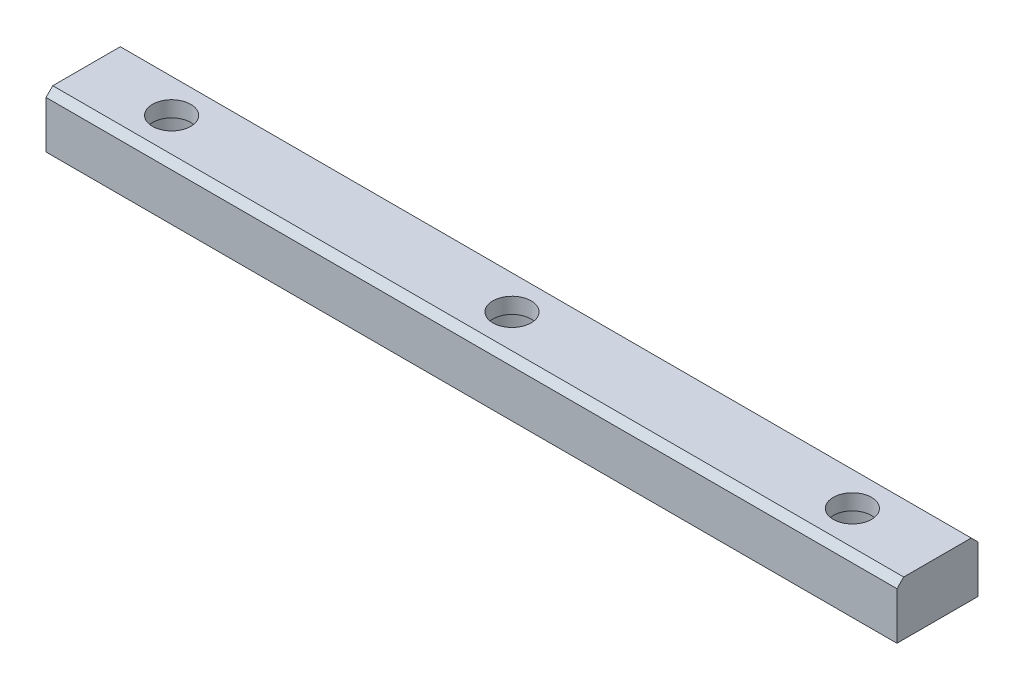
ISO-10303-21;
HEADER;
FILE_DESCRIPTION(('STEP AP214'),'2;1');
FILE_NAME('part.step','',(''),(''),'','','');
FILE_SCHEMA(('AUTOMOTIVE_DESIGN { 1 0 10303 214 1 1 1 1 }'));
ENDSEC;
DATA;
#1=APPLICATION_CONTEXT('core data for automotive mechanical design processes');
#2=APPLICATION_PROTOCOL_DEFINITION('international standard','automotive_design',2000,#1);
#3=PRODUCT_CONTEXT('',#1,'mechanical');
#4=PRODUCT('Part','Part','',(#3));
#5=PRODUCT_RELATED_PRODUCT_CATEGORY('part','',(#4));
#6=PRODUCT_DEFINITION_FORMATION('','',#4);
#7=PRODUCT_DEFINITION_CONTEXT('part definition',#1,'design');
#8=PRODUCT_DEFINITION('design','',#6,#7);
#9=PRODUCT_DEFINITION_SHAPE('','',#8);
#10=(LENGTH_UNIT() NAMED_UNIT(*) SI_UNIT(.MILLI.,.METRE.));
#11=(NAMED_UNIT(*) PLANE_ANGLE_UNIT() SI_UNIT($,.RADIAN.));
#12=(NAMED_UNIT(*) SI_UNIT($,.STERADIAN.) SOLID_ANGLE_UNIT());
#13=UNCERTAINTY_MEASURE_WITH_UNIT(LENGTH_MEASURE(1.E-05),#10,'distance_accuracy_value','');
#14=(GEOMETRIC_REPRESENTATION_CONTEXT(3) GLOBAL_UNCERTAINTY_ASSIGNED_CONTEXT((#13)) GLOBAL_UNIT_ASSIGNED_CONTEXT((#10,
#11,#12)) REPRESENTATION_CONTEXT('',''));
#15=CARTESIAN_POINT('',(0.,0.,0.));
#16=DIRECTION('',(0.,0.,1.));
#17=DIRECTION('',(1.,0.,0.));
#18=AXIS2_PLACEMENT_3D('',#15,#16,#17);
#19=CARTESIAN_POINT('',(100.,6.35,9.525));
#20=DIRECTION('',(0.,0.,-1.));
#21=DIRECTION('',(0.,1.,0.));
#22=AXIS2_PLACEMENT_3D('',#19,#20,#21);
#23=PLANE('',#22);
#24=DIRECTION('',(0.,-1.,0.));
#25=VECTOR('',#24,1.);
#26=CARTESIAN_POINT('',(100.,6.35,9.525));
#27=LINE('',#26,#25);
#28=CARTESIAN_POINT('',(100.,4.76250000000004,9.525));
#29=VERTEX_POINT('',#28);
#30=CARTESIAN_POINT('',(100.,-6.35,9.525));
#31=VERTEX_POINT('',#30);
#32=EDGE_CURVE('E87',#29,#31,#27,.T.);
#33=ORIENTED_EDGE('',*,*,#32,.F.);
#34=DIRECTION('',(-1.,0.,0.));
#35=VECTOR('',#34,1.);
#36=CARTESIAN_POINT('',(100.,4.76250000000003,9.525));
#37=LINE('',#36,#35);
#38=CARTESIAN_POINT('',(-100.,4.76250000000004,9.525));
#39=VERTEX_POINT('',#38);
#40=EDGE_CURVE('E11',#29,#39,#37,.T.);
#41=ORIENTED_EDGE('',*,*,#40,.T.);
#42=DIRECTION('',(0.,-1.,0.));
#43=VECTOR('',#42,1.);
#44=CARTESIAN_POINT('',(-100.,6.35,9.525));
#45=LINE('',#44,#43);
#46=CARTESIAN_POINT('',(-100.,-6.35,9.525));
#47=VERTEX_POINT('',#46);
#48=EDGE_CURVE('E106',#39,#47,#45,.T.);
#49=ORIENTED_EDGE('',*,*,#48,.T.);
#50=DIRECTION('',(-1.,0.,0.));
#51=VECTOR('',#50,1.);
#52=CARTESIAN_POINT('',(100.,-6.35,9.525));
#53=LINE('',#52,#51);
#54=EDGE_CURVE('E100',#31,#47,#53,.T.);
#55=ORIENTED_EDGE('',*,*,#54,.F.);
#56=EDGE_LOOP('',(#33,#41,#49,#55));
#57=FACE_BOUND('',#56,.T.);
#58=ADVANCED_FACE('F34',(#57),#23,.F.);
#59=CARTESIAN_POINT('',(100.,-6.35,9.525));
#60=DIRECTION('',(0.,1.,0.));
#61=DIRECTION('',(0.,0.,1.));
#62=AXIS2_PLACEMENT_3D('',#59,#60,#61);
#63=PLANE('',#62);
#64=CARTESIAN_POINT('',(-80.,-6.35,0.));
#65=DIRECTION('',(0.,-1.,0.));
#66=DIRECTION('',(0.,0.,-1.));
#67=AXIS2_PLACEMENT_3D('',#64,#65,#66);
#68=CIRCLE('',#67,7.49999999999999);
#69=CARTESIAN_POINT('',(-80.,-6.35,-7.49999999999999));
#70=VERTEX_POINT('',#69);
#71=EDGE_CURVE('E178',#70,#70,#68,.T.);
#72=ORIENTED_EDGE('',*,*,#71,.F.);
#73=EDGE_LOOP('',(#72));
#74=FACE_BOUND('',#73,.T.);
#75=CARTESIAN_POINT('',(0.,-6.35,0.));
#76=DIRECTION('',(0.,-1.,0.));
#77=DIRECTION('',(0.,0.,-1.));
#78=AXIS2_PLACEMENT_3D('',#75,#76,#77);
#79=CIRCLE('',#78,7.5);
#80=CARTESIAN_POINT('',(0.,-6.35,-7.5));
#81=VERTEX_POINT('',#80);
#82=EDGE_CURVE('E166',#81,#81,#79,.T.);
#83=ORIENTED_EDGE('',*,*,#82,.F.);
#84=EDGE_LOOP('',(#83));
#85=FACE_BOUND('',#84,.T.);
#86=CARTESIAN_POINT('',(80.,-6.35,0.));
#87=DIRECTION('',(0.,-1.,0.));
#88=DIRECTION('',(0.,0.,-1.));
#89=AXIS2_PLACEMENT_3D('',#86,#87,#88);
#90=CIRCLE('',#89,7.49999999999999);
#91=CARTESIAN_POINT('',(80.,-6.35,-7.49999999999999));
#92=VERTEX_POINT('',#91);
#93=EDGE_CURVE('E154',#92,#92,#90,.T.);
#94=ORIENTED_EDGE('',*,*,#93,.F.);
#95=EDGE_LOOP('',(#94));
#96=FACE_BOUND('',#95,.T.);
#97=DIRECTION('',(0.,0.,-1.));
#98=VECTOR('',#97,1.);
#99=CARTESIAN_POINT('',(-100.,-6.35,9.525));
#100=LINE('',#99,#98);
#101=CARTESIAN_POINT('',(-100.,-6.35,-9.525));
#102=VERTEX_POINT('',#101);
#103=EDGE_CURVE('E139',#47,#102,#100,.T.);
#104=ORIENTED_EDGE('',*,*,#103,.T.);
#105=DIRECTION('',(-1.,0.,0.));
#106=VECTOR('',#105,1.);
#107=CARTESIAN_POINT('',(100.,-6.35,-9.525));
#108=LINE('',#107,#106);
#109=CARTESIAN_POINT('',(100.,-6.35,-9.525));
#110=VERTEX_POINT('',#109);
#111=EDGE_CURVE('E102',#110,#102,#108,.T.);
#112=ORIENTED_EDGE('',*,*,#111,.F.);
#113=DIRECTION('',(0.,0.,-1.));
#114=VECTOR('',#113,1.);
#115=CARTESIAN_POINT('',(100.,-6.35,9.525));
#116=LINE('',#115,#114);
#117=EDGE_CURVE('E90',#31,#110,#116,.T.);
#118=ORIENTED_EDGE('',*,*,#117,.F.);
#119=ORIENTED_EDGE('',*,*,#54,.T.);
#120=EDGE_LOOP('',(#104,#112,#118,#119));
#121=FACE_BOUND('',#120,.T.);
#122=ADVANCED_FACE('F99',(#74,#85,#96,#121),#63,.F.);
#123=CARTESIAN_POINT('',(100.,6.35,-9.525));
#124=DIRECTION('',(0.,0.,1.));
#125=DIRECTION('',(0.,-1.,0.));
#126=AXIS2_PLACEMENT_3D('',#123,#124,#125);
#127=PLANE('',#126);
#128=DIRECTION('',(0.,1.,0.));
#129=VECTOR('',#128,1.);
#130=CARTESIAN_POINT('',(-100.,6.35,-9.525));
#131=LINE('',#130,#129);
#132=CARTESIAN_POINT('',(-100.,4.76250000000003,-9.525));
#133=VERTEX_POINT('',#132);
#134=EDGE_CURVE('E137',#102,#133,#131,.T.);
#135=ORIENTED_EDGE('',*,*,#134,.T.);
#136=DIRECTION('',(1.,0.,0.));
#137=VECTOR('',#136,1.);
#138=CARTESIAN_POINT('',(100.,4.76250000000003,-9.525));
#139=LINE('',#138,#137);
#140=CARTESIAN_POINT('',(100.,4.76250000000004,-9.525));
#141=VERTEX_POINT('',#140);
#142=EDGE_CURVE('E57',#133,#141,#139,.T.);
#143=ORIENTED_EDGE('',*,*,#142,.T.);
#144=DIRECTION('',(0.,1.,0.));
#145=VECTOR('',#144,1.);
#146=CARTESIAN_POINT('',(100.,6.35,-9.525));
#147=LINE('',#146,#145);
#148=EDGE_CURVE('E103',#110,#141,#147,.T.);
#149=ORIENTED_EDGE('',*,*,#148,.F.);
#150=ORIENTED_EDGE('',*,*,#111,.T.);
#151=EDGE_LOOP('',(#135,#143,#149,#150));
#152=FACE_BOUND('',#151,.T.);
#153=ADVANCED_FACE('F138',(#152),#127,.F.);
#154=CARTESIAN_POINT('',(100.,6.35,9.525));
#155=DIRECTION('',(0.,-1.,0.));
#156=DIRECTION('',(0.,0.,-1.));
#157=AXIS2_PLACEMENT_3D('',#154,#155,#156);
#158=PLANE('',#157);
#159=CARTESIAN_POINT('',(-80.,6.35,0.));
#160=DIRECTION('',(0.,-1.,0.));
#161=DIRECTION('',(0.,0.,-1.));
#162=AXIS2_PLACEMENT_3D('',#159,#160,#161);
#163=CIRCLE('',#162,4.49999999999999);
#164=CARTESIAN_POINT('',(-80.,6.35,-4.49999999999999));
#165=VERTEX_POINT('',#164);
#166=EDGE_CURVE('E169',#165,#165,#163,.T.);
#167=ORIENTED_EDGE('',*,*,#166,.T.);
#168=EDGE_LOOP('',(#167));
#169=FACE_BOUND('',#168,.T.);
#170=CARTESIAN_POINT('',(0.,6.35,0.));
#171=DIRECTION('',(0.,-1.,0.));
#172=DIRECTION('',(0.,0.,-1.));
#173=AXIS2_PLACEMENT_3D('',#170,#171,#172);
#174=CIRCLE('',#173,4.5);
#175=CARTESIAN_POINT('',(0.,6.35,-4.5));
#176=VERTEX_POINT('',#175);
#177=EDGE_CURVE('E157',#176,#176,#174,.T.);
#178=ORIENTED_EDGE('',*,*,#177,.T.);
#179=EDGE_LOOP('',(#178));
#180=FACE_BOUND('',#179,.T.);
#181=CARTESIAN_POINT('',(80.,6.35,0.));
#182=DIRECTION('',(0.,-1.,0.));
#183=DIRECTION('',(0.,0.,-1.));
#184=AXIS2_PLACEMENT_3D('',#181,#182,#183);
#185=CIRCLE('',#184,4.5);
#186=CARTESIAN_POINT('',(80.,6.35,-4.5));
#187=VERTEX_POINT('',#186);
#188=EDGE_CURVE('E143',#187,#187,#185,.T.);
#189=ORIENTED_EDGE('',*,*,#188,.T.);
#190=EDGE_LOOP('',(#189));
#191=FACE_BOUND('',#190,.T.);
#192=DIRECTION('',(0.,0.,1.));
#193=VECTOR('',#192,1.);
#194=CARTESIAN_POINT('',(100.,6.35,9.525));
#195=LINE('',#194,#193);
#196=CARTESIAN_POINT('',(100.,6.35,-7.93750000000003));
#197=VERTEX_POINT('',#196);
#198=CARTESIAN_POINT('',(100.,6.35,7.93750000000001));
#199=VERTEX_POINT('',#198);
#200=EDGE_CURVE('E112',#197,#199,#195,.T.);
#201=ORIENTED_EDGE('',*,*,#200,.F.);
#202=DIRECTION('',(-1.,0.,0.));
#203=VECTOR('',#202,1.);
#204=CARTESIAN_POINT('',(100.,6.35,-7.93750000000003));
#205=LINE('',#204,#203);
#206=CARTESIAN_POINT('',(-100.,6.35,-7.93750000000003));
#207=VERTEX_POINT('',#206);
#208=EDGE_CURVE('E110',#197,#207,#205,.T.);
#209=ORIENTED_EDGE('',*,*,#208,.T.);
#210=DIRECTION('',(0.,0.,1.));
#211=VECTOR('',#210,1.);
#212=CARTESIAN_POINT('',(-100.,6.35,9.525));
#213=LINE('',#212,#211);
#214=CARTESIAN_POINT('',(-100.,6.35,7.93750000000001));
#215=VERTEX_POINT('',#214);
#216=EDGE_CURVE('E95',#207,#215,#213,.T.);
#217=ORIENTED_EDGE('',*,*,#216,.T.);
#218=DIRECTION('',(1.,0.,0.));
#219=VECTOR('',#218,1.);
#220=CARTESIAN_POINT('',(100.,6.35,7.93750000000001));
#221=LINE('',#220,#219);
#222=EDGE_CURVE('E108',#215,#199,#221,.T.);
#223=ORIENTED_EDGE('',*,*,#222,.T.);
#224=EDGE_LOOP('',(#201,#209,#217,#223));
#225=FACE_BOUND('',#224,.T.);
#226=ADVANCED_FACE('F128',(#169,#180,#191,#225),#158,.F.);
#227=CARTESIAN_POINT('',(100.,0.,0.));
#228=DIRECTION('',(1.,0.,0.));
#229=DIRECTION('',(0.,0.,-1.));
#230=AXIS2_PLACEMENT_3D('',#227,#228,#229);
#231=PLANE('',#230);
#232=ORIENTED_EDGE('',*,*,#148,.T.);
#233=DIRECTION('',(0.,-0.707106781186547,-0.707106781186548));
#234=VECTOR('',#233,1.);
#235=CARTESIAN_POINT('',(100.,7.14375000000002,-7.14375000000001));
#236=LINE('',#235,#234);
#237=EDGE_CURVE('E42',#141,#197,#236,.F.);
#238=ORIENTED_EDGE('',*,*,#237,.T.);
#239=ORIENTED_EDGE('',*,*,#200,.T.);
#240=DIRECTION('',(0.,0.707106781186541,-0.707106781186554));
#241=VECTOR('',#240,1.);
#242=CARTESIAN_POINT('',(100.,7.14375000000006,7.14374999999993));
#243=LINE('',#242,#241);
#244=EDGE_CURVE('E49',#199,#29,#243,.F.);
#245=ORIENTED_EDGE('',*,*,#244,.T.);
#246=ORIENTED_EDGE('',*,*,#32,.T.);
#247=ORIENTED_EDGE('',*,*,#117,.T.);
#248=EDGE_LOOP('',(#232,#238,#239,#245,#246,#247));
#249=FACE_BOUND('',#248,.T.);
#250=ADVANCED_FACE('F89',(#249),#231,.T.);
#251=CARTESIAN_POINT('',(-100.,0.,0.));
#252=DIRECTION('',(1.,0.,0.));
#253=DIRECTION('',(0.,0.,-1.));
#254=AXIS2_PLACEMENT_3D('',#251,#252,#253);
#255=PLANE('',#254);
#256=ORIENTED_EDGE('',*,*,#216,.F.);
#257=DIRECTION('',(0.,0.707106781186547,0.707106781186548));
#258=VECTOR('',#257,1.);
#259=CARTESIAN_POINT('',(-100.,6.35,-7.93750000000003));
#260=LINE('',#259,#258);
#261=EDGE_CURVE('E120',#207,#133,#260,.F.);
#262=ORIENTED_EDGE('',*,*,#261,.T.);
#263=ORIENTED_EDGE('',*,*,#134,.F.);
#264=ORIENTED_EDGE('',*,*,#103,.F.);
#265=ORIENTED_EDGE('',*,*,#48,.F.);
#266=DIRECTION('',(0.,-0.707106781186541,0.707106781186554));
#267=VECTOR('',#266,1.);
#268=CARTESIAN_POINT('',(-100.,4.76250000000003,9.525));
#269=LINE('',#268,#267);
#270=EDGE_CURVE('E118',#39,#215,#269,.F.);
#271=ORIENTED_EDGE('',*,*,#270,.T.);
#272=EDGE_LOOP('',(#256,#262,#263,#264,#265,#271));
#273=FACE_BOUND('',#272,.T.);
#274=ADVANCED_FACE('F136',(#273),#255,.F.);
#275=CARTESIAN_POINT('',(80.,-6.35,0.));
#276=DIRECTION('',(0.,-1.,0.));
#277=DIRECTION('',(0.,0.,-1.));
#278=AXIS2_PLACEMENT_3D('',#275,#276,#277);
#279=CYLINDRICAL_SURFACE('',#278,4.5);
#280=ORIENTED_EDGE('',*,*,#188,.F.);
#281=EDGE_LOOP('',(#280));
#282=FACE_BOUND('',#281,.T.);
#283=CARTESIAN_POINT('',(80.,2.65,0.));
#284=DIRECTION('',(0.,-1.,0.));
#285=DIRECTION('',(0.,0.,-1.));
#286=AXIS2_PLACEMENT_3D('',#283,#284,#285);
#287=CIRCLE('',#286,4.5);
#288=CARTESIAN_POINT('',(80.,2.65,-4.5));
#289=VERTEX_POINT('',#288);
#290=EDGE_CURVE('E148',#289,#289,#287,.T.);
#291=ORIENTED_EDGE('',*,*,#290,.T.);
#292=EDGE_LOOP('',(#291));
#293=FACE_BOUND('',#292,.T.);
#294=ADVANCED_FACE('F204',(#282,#293),#279,.F.);
#295=CARTESIAN_POINT('',(84.5,2.65,0.));
#296=DIRECTION('',(0.,1.,0.));
#297=DIRECTION('',(0.,0.,1.));
#298=AXIS2_PLACEMENT_3D('',#295,#296,#297);
#299=PLANE('',#298);
#300=ORIENTED_EDGE('',*,*,#290,.F.);
#301=EDGE_LOOP('',(#300));
#302=FACE_BOUND('',#301,.T.);
#303=CARTESIAN_POINT('',(80.,2.65,0.));
#304=DIRECTION('',(0.,-1.,0.));
#305=DIRECTION('',(0.,0.,-1.));
#306=AXIS2_PLACEMENT_3D('',#303,#304,#305);
#307=CIRCLE('',#306,7.49999999999999);
#308=CARTESIAN_POINT('',(80.,2.65,-7.49999999999999));
#309=VERTEX_POINT('',#308);
#310=EDGE_CURVE('E151',#309,#309,#307,.T.);
#311=ORIENTED_EDGE('',*,*,#310,.T.);
#312=EDGE_LOOP('',(#311));
#313=FACE_BOUND('',#312,.T.);
#314=ADVANCED_FACE('F194',(#302,#313),#299,.F.);
#315=CARTESIAN_POINT('',(80.,-6.35,0.));
#316=DIRECTION('',(0.,-1.,0.));
#317=DIRECTION('',(0.,0.,-1.));
#318=AXIS2_PLACEMENT_3D('',#315,#316,#317);
#319=CYLINDRICAL_SURFACE('',#318,7.49999999999999);
#320=ORIENTED_EDGE('',*,*,#310,.F.);
#321=EDGE_LOOP('',(#320));
#322=FACE_BOUND('',#321,.T.);
#323=ORIENTED_EDGE('',*,*,#93,.T.);
#324=EDGE_LOOP('',(#323));
#325=FACE_BOUND('',#324,.T.);
#326=ADVANCED_FACE('F191',(#322,#325),#319,.F.);
#327=CARTESIAN_POINT('',(0.,-6.35,0.));
#328=DIRECTION('',(0.,-1.,0.));
#329=DIRECTION('',(0.,0.,-1.));
#330=AXIS2_PLACEMENT_3D('',#327,#328,#329);
#331=CYLINDRICAL_SURFACE('',#330,4.5);
#332=ORIENTED_EDGE('',*,*,#177,.F.);
#333=EDGE_LOOP('',(#332));
#334=FACE_BOUND('',#333,.T.);
#335=CARTESIAN_POINT('',(0.,2.65,0.));
#336=DIRECTION('',(0.,-1.,0.));
#337=DIRECTION('',(0.,0.,-1.));
#338=AXIS2_PLACEMENT_3D('',#335,#336,#337);
#339=CIRCLE('',#338,4.5);
#340=CARTESIAN_POINT('',(0.,2.65,-4.5));
#341=VERTEX_POINT('',#340);
#342=EDGE_CURVE('E160',#341,#341,#339,.T.);
#343=ORIENTED_EDGE('',*,*,#342,.T.);
#344=EDGE_LOOP('',(#343));
#345=FACE_BOUND('',#344,.T.);
#346=ADVANCED_FACE('F193',(#334,#345),#331,.F.);
#347=CARTESIAN_POINT('',(4.5,2.65,0.));
#348=DIRECTION('',(0.,1.,0.));
#349=DIRECTION('',(0.,0.,1.));
#350=AXIS2_PLACEMENT_3D('',#347,#348,#349);
#351=PLANE('',#350);
#352=ORIENTED_EDGE('',*,*,#342,.F.);
#353=EDGE_LOOP('',(#352));
#354=FACE_BOUND('',#353,.T.);
#355=CARTESIAN_POINT('',(0.,2.65,0.));
#356=DIRECTION('',(0.,-1.,0.));
#357=DIRECTION('',(0.,0.,-1.));
#358=AXIS2_PLACEMENT_3D('',#355,#356,#357);
#359=CIRCLE('',#358,7.5);
#360=CARTESIAN_POINT('',(0.,2.65,-7.5));
#361=VERTEX_POINT('',#360);
#362=EDGE_CURVE('E163',#361,#361,#359,.T.);
#363=ORIENTED_EDGE('',*,*,#362,.T.);
#364=EDGE_LOOP('',(#363));
#365=FACE_BOUND('',#364,.T.);
#366=ADVANCED_FACE('F201',(#354,#365),#351,.F.);
#367=CARTESIAN_POINT('',(0.,-6.35,0.));
#368=DIRECTION('',(0.,-1.,0.));
#369=DIRECTION('',(0.,0.,-1.));
#370=AXIS2_PLACEMENT_3D('',#367,#368,#369);
#371=CYLINDRICAL_SURFACE('',#370,7.5);
#372=ORIENTED_EDGE('',*,*,#362,.F.);
#373=EDGE_LOOP('',(#372));
#374=FACE_BOUND('',#373,.T.);
#375=ORIENTED_EDGE('',*,*,#82,.T.);
#376=EDGE_LOOP('',(#375));
#377=FACE_BOUND('',#376,.T.);
#378=ADVANCED_FACE('F232',(#374,#377),#371,.F.);
#379=CARTESIAN_POINT('',(-80.,-6.35,0.));
#380=DIRECTION('',(0.,-1.,0.));
#381=DIRECTION('',(0.,0.,-1.));
#382=AXIS2_PLACEMENT_3D('',#379,#380,#381);
#383=CYLINDRICAL_SURFACE('',#382,4.5);
#384=ORIENTED_EDGE('',*,*,#166,.F.);
#385=EDGE_LOOP('',(#384));
#386=FACE_BOUND('',#385,.T.);
#387=CARTESIAN_POINT('',(-80.,2.65,0.));
#388=DIRECTION('',(0.,-1.,0.));
#389=DIRECTION('',(0.,0.,-1.));
#390=AXIS2_PLACEMENT_3D('',#387,#388,#389);
#391=CIRCLE('',#390,4.5);
#392=CARTESIAN_POINT('',(-80.,2.65,-4.5));
#393=VERTEX_POINT('',#392);
#394=EDGE_CURVE('E172',#393,#393,#391,.T.);
#395=ORIENTED_EDGE('',*,*,#394,.T.);
#396=EDGE_LOOP('',(#395));
#397=FACE_BOUND('',#396,.T.);
#398=ADVANCED_FACE('F225',(#386,#397),#383,.F.);
#399=CARTESIAN_POINT('',(-75.5,2.65,0.));
#400=DIRECTION('',(0.,1.,0.));
#401=DIRECTION('',(0.,0.,1.));
#402=AXIS2_PLACEMENT_3D('',#399,#400,#401);
#403=PLANE('',#402);
#404=ORIENTED_EDGE('',*,*,#394,.F.);
#405=EDGE_LOOP('',(#404));
#406=FACE_BOUND('',#405,.T.);
#407=CARTESIAN_POINT('',(-80.,2.65,0.));
#408=DIRECTION('',(0.,-1.,0.));
#409=DIRECTION('',(0.,0.,-1.));
#410=AXIS2_PLACEMENT_3D('',#407,#408,#409);
#411=CIRCLE('',#410,7.49999999999999);
#412=CARTESIAN_POINT('',(-80.,2.65,-7.49999999999999));
#413=VERTEX_POINT('',#412);
#414=EDGE_CURVE('E175',#413,#413,#411,.T.);
#415=ORIENTED_EDGE('',*,*,#414,.T.);
#416=EDGE_LOOP('',(#415));
#417=FACE_BOUND('',#416,.T.);
#418=ADVANCED_FACE('F219',(#406,#417),#403,.F.);
#419=CARTESIAN_POINT('',(-80.,-6.35,0.));
#420=DIRECTION('',(0.,-1.,0.));
#421=DIRECTION('',(0.,0.,-1.));
#422=AXIS2_PLACEMENT_3D('',#419,#420,#421);
#423=CYLINDRICAL_SURFACE('',#422,7.49999999999999);
#424=ORIENTED_EDGE('',*,*,#414,.F.);
#425=EDGE_LOOP('',(#424));
#426=FACE_BOUND('',#425,.T.);
#427=ORIENTED_EDGE('',*,*,#71,.T.);
#428=EDGE_LOOP('',(#427));
#429=FACE_BOUND('',#428,.T.);
#430=ADVANCED_FACE('F182',(#426,#429),#423,.F.);
#431=CARTESIAN_POINT('',(100.,6.35,-7.93750000000003));
#432=DIRECTION('',(0.,-0.707106781186548,0.707106781186547));
#433=DIRECTION('',(-1.,0.,0.));
#434=AXIS2_PLACEMENT_3D('',#431,#432,#433);
#435=PLANE('',#434);
#436=ORIENTED_EDGE('',*,*,#237,.F.);
#437=ORIENTED_EDGE('',*,*,#142,.F.);
#438=ORIENTED_EDGE('',*,*,#261,.F.);
#439=ORIENTED_EDGE('',*,*,#208,.F.);
#440=EDGE_LOOP('',(#436,#437,#438,#439));
#441=FACE_BOUND('',#440,.T.);
#442=ADVANCED_FACE('F133',(#441),#435,.F.);
#443=CARTESIAN_POINT('',(100.,4.76250000000003,9.525));
#444=DIRECTION('',(0.,-0.707106781186554,-0.707106781186541));
#445=DIRECTION('',(-1.,0.,0.));
#446=AXIS2_PLACEMENT_3D('',#443,#444,#445);
#447=PLANE('',#446);
#448=ORIENTED_EDGE('',*,*,#244,.F.);
#449=ORIENTED_EDGE('',*,*,#222,.F.);
#450=ORIENTED_EDGE('',*,*,#270,.F.);
#451=ORIENTED_EDGE('',*,*,#40,.F.);
#452=EDGE_LOOP('',(#448,#449,#450,#451));
#453=FACE_BOUND('',#452,.T.);
#454=ADVANCED_FACE('F36',(#453),#447,.F.);
#455=CLOSED_SHELL('',(#58,#122,#153,#226,#250,#274,#294,#314,#326,#346,#366,#378,#398,#418,#430,
#442,#454));
#456=MANIFOLD_SOLID_BREP('B2',#455);
#457=ADVANCED_BREP_SHAPE_REPRESENTATION('',(#18,#456),#14);
#458=SHAPE_DEFINITION_REPRESENTATION(#9,#457);
ENDSEC;
END-ISO-10303-21;
